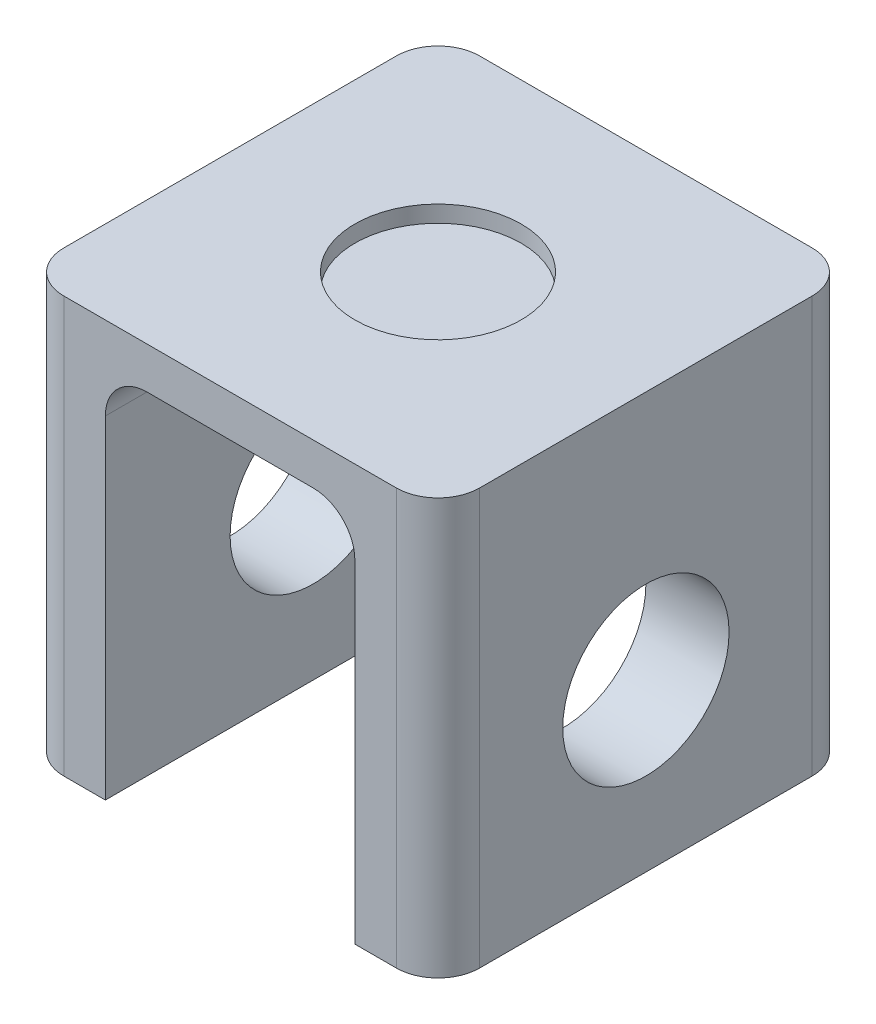
ISO-10303-21;
HEADER;
FILE_DESCRIPTION(('STEP AP214'),'2;1');
FILE_NAME('part.step','',(''),(''),'','','');
FILE_SCHEMA(('AUTOMOTIVE_DESIGN { 1 0 10303 214 1 1 1 1 }'));
ENDSEC;
DATA;
#1=APPLICATION_CONTEXT('core data for automotive mechanical design processes');
#2=APPLICATION_PROTOCOL_DEFINITION('international standard','automotive_design',2000,#1);
#3=PRODUCT_CONTEXT('',#1,'mechanical');
#4=PRODUCT('Part','Part','',(#3));
#5=PRODUCT_RELATED_PRODUCT_CATEGORY('part','',(#4));
#6=PRODUCT_DEFINITION_FORMATION('','',#4);
#7=PRODUCT_DEFINITION_CONTEXT('part definition',#1,'design');
#8=PRODUCT_DEFINITION('design','',#6,#7);
#9=PRODUCT_DEFINITION_SHAPE('','',#8);
#10=(LENGTH_UNIT() NAMED_UNIT(*) SI_UNIT(.MILLI.,.METRE.));
#11=(NAMED_UNIT(*) PLANE_ANGLE_UNIT() SI_UNIT($,.RADIAN.));
#12=(NAMED_UNIT(*) SI_UNIT($,.STERADIAN.) SOLID_ANGLE_UNIT());
#13=UNCERTAINTY_MEASURE_WITH_UNIT(LENGTH_MEASURE(1.E-05),#10,'distance_accuracy_value','');
#14=(GEOMETRIC_REPRESENTATION_CONTEXT(3) GLOBAL_UNCERTAINTY_ASSIGNED_CONTEXT((#13)) GLOBAL_UNIT_ASSIGNED_CONTEXT((#10,
#11,#12)) REPRESENTATION_CONTEXT('',''));
#15=CARTESIAN_POINT('',(0.,0.,0.));
#16=DIRECTION('',(0.,0.,1.));
#17=DIRECTION('',(1.,0.,0.));
#18=AXIS2_PLACEMENT_3D('',#15,#16,#17);
#19=CARTESIAN_POINT('',(0.,0.,0.));
#20=DIRECTION('',(0.,-1.,0.));
#21=DIRECTION('',(0.,0.,-1.));
#22=AXIS2_PLACEMENT_3D('',#19,#20,#21);
#23=PLANE('',#22);
#24=DIRECTION('',(0.,0.,-1.));
#25=VECTOR('',#24,1.);
#26=CARTESIAN_POINT('',(50.,0.,50.));
#27=LINE('',#26,#25);
#28=CARTESIAN_POINT('',(50.,0.,40.));
#29=VERTEX_POINT('',#28);
#30=CARTESIAN_POINT('',(50.,0.,-40.));
#31=VERTEX_POINT('',#30);
#32=EDGE_CURVE('E302',#29,#31,#27,.T.);
#33=ORIENTED_EDGE('',*,*,#32,.F.);
#34=CARTESIAN_POINT('',(40.,0.,40.));
#35=DIRECTION('',(0.,-1.,0.));
#36=DIRECTION('',(0.,0.,-1.));
#37=AXIS2_PLACEMENT_3D('',#34,#35,#36);
#38=CIRCLE('',#37,10.);
#39=CARTESIAN_POINT('',(40.,0.,50.));
#40=VERTEX_POINT('',#39);
#41=EDGE_CURVE('E168',#29,#40,#38,.T.);
#42=ORIENTED_EDGE('',*,*,#41,.T.);
#43=DIRECTION('',(1.,0.,0.));
#44=VECTOR('',#43,1.);
#45=CARTESIAN_POINT('',(-50.,0.,50.));
#46=LINE('',#45,#44);
#47=CARTESIAN_POINT('',(30.,0.,50.));
#48=VERTEX_POINT('',#47);
#49=EDGE_CURVE('E149',#48,#40,#46,.T.);
#50=ORIENTED_EDGE('',*,*,#49,.F.);
#51=DIRECTION('',(0.,0.,1.));
#52=VECTOR('',#51,1.);
#53=CARTESIAN_POINT('',(30.,0.,-50.));
#54=LINE('',#53,#52);
#55=CARTESIAN_POINT('',(30.,0.,-50.));
#56=VERTEX_POINT('',#55);
#57=EDGE_CURVE('E157',#56,#48,#54,.T.);
#58=ORIENTED_EDGE('',*,*,#57,.F.);
#59=DIRECTION('',(-1.,0.,0.));
#60=VECTOR('',#59,1.);
#61=CARTESIAN_POINT('',(-50.,0.,-50.));
#62=LINE('',#61,#60);
#63=CARTESIAN_POINT('',(40.,0.,-50.));
#64=VERTEX_POINT('',#63);
#65=EDGE_CURVE('E176',#64,#56,#62,.T.);
#66=ORIENTED_EDGE('',*,*,#65,.F.);
#67=CARTESIAN_POINT('',(40.,0.,-40.));
#68=DIRECTION('',(0.,-1.,0.));
#69=DIRECTION('',(0.,0.,-1.));
#70=AXIS2_PLACEMENT_3D('',#67,#68,#69);
#71=CIRCLE('',#70,10.);
#72=EDGE_CURVE('E218',#64,#31,#71,.T.);
#73=ORIENTED_EDGE('',*,*,#72,.T.);
#74=EDGE_LOOP('',(#33,#42,#50,#58,#66,#73));
#75=FACE_BOUND('',#74,.T.);
#76=ADVANCED_FACE('F44',(#75),#23,.T.);
#77=CARTESIAN_POINT('',(50.,100.,50.));
#78=DIRECTION('',(-1.,0.,0.));
#79=DIRECTION('',(0.,0.,1.));
#80=AXIS2_PLACEMENT_3D('',#77,#78,#79);
#81=PLANE('',#80);
#82=CARTESIAN_POINT('',(50.,40.,0.));
#83=DIRECTION('',(-1.,0.,0.));
#84=DIRECTION('',(0.,0.,1.));
#85=AXIS2_PLACEMENT_3D('',#82,#83,#84);
#86=CIRCLE('',#85,20.);
#87=CARTESIAN_POINT('',(50.,40.,20.));
#88=VERTEX_POINT('',#87);
#89=EDGE_CURVE('E170',#88,#88,#86,.T.);
#90=ORIENTED_EDGE('',*,*,#89,.T.);
#91=EDGE_LOOP('',(#90));
#92=FACE_BOUND('',#91,.T.);
#93=DIRECTION('',(0.,0.,-1.));
#94=VECTOR('',#93,1.);
#95=CARTESIAN_POINT('',(50.,100.,50.));
#96=LINE('',#95,#94);
#97=CARTESIAN_POINT('',(50.,100.,40.));
#98=VERTEX_POINT('',#97);
#99=CARTESIAN_POINT('',(50.,100.,-40.));
#100=VERTEX_POINT('',#99);
#101=EDGE_CURVE('E172',#98,#100,#96,.T.);
#102=ORIENTED_EDGE('',*,*,#101,.F.);
#103=DIRECTION('',(0.,-1.,0.));
#104=VECTOR('',#103,1.);
#105=CARTESIAN_POINT('',(50.,100.,40.));
#106=LINE('',#105,#104);
#107=EDGE_CURVE('E216',#98,#29,#106,.T.);
#108=ORIENTED_EDGE('',*,*,#107,.T.);
#109=ORIENTED_EDGE('',*,*,#32,.T.);
#110=DIRECTION('',(0.,-1.,0.));
#111=VECTOR('',#110,1.);
#112=CARTESIAN_POINT('',(50.,100.,-40.));
#113=LINE('',#112,#111);
#114=EDGE_CURVE('E212',#31,#100,#113,.F.);
#115=ORIENTED_EDGE('',*,*,#114,.T.);
#116=EDGE_LOOP('',(#102,#108,#109,#115));
#117=FACE_BOUND('',#116,.T.);
#118=ADVANCED_FACE('F256',(#92,#117),#81,.F.);
#119=CARTESIAN_POINT('',(-50.,100.,-50.));
#120=DIRECTION('',(0.,0.,1.));
#121=DIRECTION('',(1.,0.,0.));
#122=AXIS2_PLACEMENT_3D('',#119,#120,#121);
#123=PLANE('',#122);
#124=CARTESIAN_POINT('',(-30.,0.,-50.));
#125=VERTEX_POINT('',#124);
#126=CARTESIAN_POINT('',(-40.,0.,-50.));
#127=VERTEX_POINT('',#126);
#128=EDGE_CURVE('E307',#125,#127,#62,.T.);
#129=ORIENTED_EDGE('',*,*,#128,.T.);
#130=DIRECTION('',(0.,-1.,0.));
#131=VECTOR('',#130,1.);
#132=CARTESIAN_POINT('',(-40.,100.,-50.));
#133=LINE('',#132,#131);
#134=CARTESIAN_POINT('',(-40.,100.,-50.));
#135=VERTEX_POINT('',#134);
#136=EDGE_CURVE('E200',#127,#135,#133,.F.);
#137=ORIENTED_EDGE('',*,*,#136,.T.);
#138=DIRECTION('',(-1.,0.,0.));
#139=VECTOR('',#138,1.);
#140=CARTESIAN_POINT('',(-50.,100.,-50.));
#141=LINE('',#140,#139);
#142=CARTESIAN_POINT('',(40.,100.,-50.));
#143=VERTEX_POINT('',#142);
#144=EDGE_CURVE('E304',#143,#135,#141,.T.);
#145=ORIENTED_EDGE('',*,*,#144,.F.);
#146=DIRECTION('',(0.,-1.,0.));
#147=VECTOR('',#146,1.);
#148=CARTESIAN_POINT('',(40.,100.,-50.));
#149=LINE('',#148,#147);
#150=EDGE_CURVE('E198',#143,#64,#149,.T.);
#151=ORIENTED_EDGE('',*,*,#150,.T.);
#152=ORIENTED_EDGE('',*,*,#65,.T.);
#153=DIRECTION('',(0.,-1.,0.));
#154=VECTOR('',#153,1.);
#155=CARTESIAN_POINT('',(30.,90.,-50.));
#156=LINE('',#155,#154);
#157=CARTESIAN_POINT('',(30.,80.,-50.));
#158=VERTEX_POINT('',#157);
#159=EDGE_CURVE('E165',#158,#56,#156,.T.);
#160=ORIENTED_EDGE('',*,*,#159,.F.);
#161=CARTESIAN_POINT('',(20.,80.,-50.));
#162=DIRECTION('',(0.,0.,1.));
#163=DIRECTION('',(1.,0.,0.));
#164=AXIS2_PLACEMENT_3D('',#161,#162,#163);
#165=CIRCLE('',#164,10.);
#166=CARTESIAN_POINT('',(20.,90.,-50.));
#167=VERTEX_POINT('',#166);
#168=EDGE_CURVE('E231',#158,#167,#165,.T.);
#169=ORIENTED_EDGE('',*,*,#168,.T.);
#170=DIRECTION('',(1.,0.,0.));
#171=VECTOR('',#170,1.);
#172=CARTESIAN_POINT('',(-30.,90.,-50.));
#173=LINE('',#172,#171);
#174=CARTESIAN_POINT('',(-20.,90.,-50.));
#175=VERTEX_POINT('',#174);
#176=EDGE_CURVE('E156',#175,#167,#173,.T.);
#177=ORIENTED_EDGE('',*,*,#176,.F.);
#178=CARTESIAN_POINT('',(-20.,80.,-50.));
#179=DIRECTION('',(0.,0.,1.));
#180=DIRECTION('',(1.,0.,0.));
#181=AXIS2_PLACEMENT_3D('',#178,#179,#180);
#182=CIRCLE('',#181,10.);
#183=CARTESIAN_POINT('',(-30.,80.,-50.));
#184=VERTEX_POINT('',#183);
#185=EDGE_CURVE('E52',#175,#184,#182,.T.);
#186=ORIENTED_EDGE('',*,*,#185,.T.);
#187=DIRECTION('',(0.,-1.,0.));
#188=VECTOR('',#187,1.);
#189=CARTESIAN_POINT('',(-30.,90.,-50.));
#190=LINE('',#189,#188);
#191=EDGE_CURVE('E313',#184,#125,#190,.T.);
#192=ORIENTED_EDGE('',*,*,#191,.T.);
#193=EDGE_LOOP('',(#129,#137,#145,#151,#152,#160,#169,#177,#186,#192));
#194=FACE_BOUND('',#193,.T.);
#195=ADVANCED_FACE('F237',(#194),#123,.F.);
#196=CARTESIAN_POINT('',(-50.,100.,50.));
#197=DIRECTION('',(1.,0.,0.));
#198=DIRECTION('',(0.,0.,-1.));
#199=AXIS2_PLACEMENT_3D('',#196,#197,#198);
#200=PLANE('',#199);
#201=CARTESIAN_POINT('',(-50.,40.,0.));
#202=DIRECTION('',(-1.,0.,0.));
#203=DIRECTION('',(0.,0.,1.));
#204=AXIS2_PLACEMENT_3D('',#201,#202,#203);
#205=CIRCLE('',#204,20.);
#206=CARTESIAN_POINT('',(-50.,40.,20.));
#207=VERTEX_POINT('',#206);
#208=EDGE_CURVE('E183',#207,#207,#205,.T.);
#209=ORIENTED_EDGE('',*,*,#208,.F.);
#210=EDGE_LOOP('',(#209));
#211=FACE_BOUND('',#210,.T.);
#212=DIRECTION('',(0.,0.,1.));
#213=VECTOR('',#212,1.);
#214=CARTESIAN_POINT('',(-50.,100.,50.));
#215=LINE('',#214,#213);
#216=CARTESIAN_POINT('',(-50.,100.,-40.));
#217=VERTEX_POINT('',#216);
#218=CARTESIAN_POINT('',(-50.,100.,40.));
#219=VERTEX_POINT('',#218);
#220=EDGE_CURVE('E299',#217,#219,#215,.T.);
#221=ORIENTED_EDGE('',*,*,#220,.F.);
#222=DIRECTION('',(0.,-1.,0.));
#223=VECTOR('',#222,1.);
#224=CARTESIAN_POINT('',(-50.,100.,-40.));
#225=LINE('',#224,#223);
#226=CARTESIAN_POINT('',(-50.,0.,-40.));
#227=VERTEX_POINT('',#226);
#228=EDGE_CURVE('E186',#217,#227,#225,.T.);
#229=ORIENTED_EDGE('',*,*,#228,.T.);
#230=DIRECTION('',(0.,0.,1.));
#231=VECTOR('',#230,1.);
#232=CARTESIAN_POINT('',(-50.,0.,50.));
#233=LINE('',#232,#231);
#234=CARTESIAN_POINT('',(-50.,0.,40.));
#235=VERTEX_POINT('',#234);
#236=EDGE_CURVE('E175',#227,#235,#233,.T.);
#237=ORIENTED_EDGE('',*,*,#236,.T.);
#238=DIRECTION('',(0.,-1.,0.));
#239=VECTOR('',#238,1.);
#240=CARTESIAN_POINT('',(-50.,100.,40.));
#241=LINE('',#240,#239);
#242=EDGE_CURVE('E188',#235,#219,#241,.F.);
#243=ORIENTED_EDGE('',*,*,#242,.T.);
#244=EDGE_LOOP('',(#221,#229,#237,#243));
#245=FACE_BOUND('',#244,.T.);
#246=ADVANCED_FACE('F290',(#211,#245),#200,.F.);
#247=CARTESIAN_POINT('',(-50.,100.,50.));
#248=DIRECTION('',(0.,0.,-1.));
#249=DIRECTION('',(-1.,0.,0.));
#250=AXIS2_PLACEMENT_3D('',#247,#248,#249);
#251=PLANE('',#250);
#252=DIRECTION('',(1.,0.,0.));
#253=VECTOR('',#252,1.);
#254=CARTESIAN_POINT('',(-50.,100.,50.));
#255=LINE('',#254,#253);
#256=CARTESIAN_POINT('',(-40.,100.,50.));
#257=VERTEX_POINT('',#256);
#258=CARTESIAN_POINT('',(40.,100.,50.));
#259=VERTEX_POINT('',#258);
#260=EDGE_CURVE('E189',#257,#259,#255,.T.);
#261=ORIENTED_EDGE('',*,*,#260,.F.);
#262=DIRECTION('',(0.,-1.,0.));
#263=VECTOR('',#262,1.);
#264=CARTESIAN_POINT('',(-40.,100.,50.));
#265=LINE('',#264,#263);
#266=CARTESIAN_POINT('',(-40.,0.,50.));
#267=VERTEX_POINT('',#266);
#268=EDGE_CURVE('E211',#257,#267,#265,.T.);
#269=ORIENTED_EDGE('',*,*,#268,.T.);
#270=CARTESIAN_POINT('',(-30.,0.,50.));
#271=VERTEX_POINT('',#270);
#272=EDGE_CURVE('E173',#267,#271,#46,.T.);
#273=ORIENTED_EDGE('',*,*,#272,.T.);
#274=DIRECTION('',(0.,-1.,0.));
#275=VECTOR('',#274,1.);
#276=CARTESIAN_POINT('',(-30.,90.,50.));
#277=LINE('',#276,#275);
#278=CARTESIAN_POINT('',(-30.,80.,50.));
#279=VERTEX_POINT('',#278);
#280=EDGE_CURVE('E154',#279,#271,#277,.T.);
#281=ORIENTED_EDGE('',*,*,#280,.F.);
#282=CARTESIAN_POINT('',(-20.,80.,50.));
#283=DIRECTION('',(0.,0.,-1.));
#284=DIRECTION('',(-1.,0.,0.));
#285=AXIS2_PLACEMENT_3D('',#282,#283,#284);
#286=CIRCLE('',#285,10.);
#287=CARTESIAN_POINT('',(-20.,90.,50.));
#288=VERTEX_POINT('',#287);
#289=EDGE_CURVE('E11',#279,#288,#286,.T.);
#290=ORIENTED_EDGE('',*,*,#289,.T.);
#291=DIRECTION('',(-1.,0.,0.));
#292=VECTOR('',#291,1.);
#293=CARTESIAN_POINT('',(-30.,90.,50.));
#294=LINE('',#293,#292);
#295=CARTESIAN_POINT('',(20.,90.,50.));
#296=VERTEX_POINT('',#295);
#297=EDGE_CURVE('E241',#296,#288,#294,.T.);
#298=ORIENTED_EDGE('',*,*,#297,.F.);
#299=CARTESIAN_POINT('',(20.,80.,50.));
#300=DIRECTION('',(0.,0.,-1.));
#301=DIRECTION('',(-1.,0.,0.));
#302=AXIS2_PLACEMENT_3D('',#299,#300,#301);
#303=CIRCLE('',#302,10.);
#304=CARTESIAN_POINT('',(30.,80.,50.));
#305=VERTEX_POINT('',#304);
#306=EDGE_CURVE('E155',#296,#305,#303,.T.);
#307=ORIENTED_EDGE('',*,*,#306,.T.);
#308=DIRECTION('',(0.,-1.,0.));
#309=VECTOR('',#308,1.);
#310=CARTESIAN_POINT('',(30.,90.,50.));
#311=LINE('',#310,#309);
#312=EDGE_CURVE('E145',#305,#48,#311,.T.);
#313=ORIENTED_EDGE('',*,*,#312,.T.);
#314=ORIENTED_EDGE('',*,*,#49,.T.);
#315=DIRECTION('',(0.,-1.,0.));
#316=VECTOR('',#315,1.);
#317=CARTESIAN_POINT('',(40.,100.,50.));
#318=LINE('',#317,#316);
#319=EDGE_CURVE('E207',#40,#259,#318,.F.);
#320=ORIENTED_EDGE('',*,*,#319,.T.);
#321=EDGE_LOOP('',(#261,#269,#273,#281,#290,#298,#307,#313,#314,#320));
#322=FACE_BOUND('',#321,.T.);
#323=ADVANCED_FACE('F150',(#322),#251,.F.);
#324=CARTESIAN_POINT('',(0.,100.,0.));
#325=DIRECTION('',(0.,-1.,0.));
#326=DIRECTION('',(0.,0.,-1.));
#327=AXIS2_PLACEMENT_3D('',#324,#325,#326);
#328=PLANE('',#327);
#329=CARTESIAN_POINT('',(0.,100.,0.));
#330=DIRECTION('',(0.,1.,0.));
#331=DIRECTION('',(0.,0.,1.));
#332=AXIS2_PLACEMENT_3D('',#329,#330,#331);
#333=CIRCLE('',#332,20.);
#334=CARTESIAN_POINT('',(0.,100.,20.));
#335=VERTEX_POINT('',#334);
#336=EDGE_CURVE('E325',#335,#335,#333,.T.);
#337=ORIENTED_EDGE('',*,*,#336,.F.);
#338=EDGE_LOOP('',(#337));
#339=FACE_BOUND('',#338,.T.);
#340=ORIENTED_EDGE('',*,*,#144,.T.);
#341=CARTESIAN_POINT('',(-40.,100.,-40.));
#342=DIRECTION('',(0.,-1.,0.));
#343=DIRECTION('',(0.,0.,-1.));
#344=AXIS2_PLACEMENT_3D('',#341,#342,#343);
#345=CIRCLE('',#344,10.);
#346=EDGE_CURVE('E210',#135,#217,#345,.F.);
#347=ORIENTED_EDGE('',*,*,#346,.T.);
#348=ORIENTED_EDGE('',*,*,#220,.T.);
#349=CARTESIAN_POINT('',(-40.,100.,40.));
#350=DIRECTION('',(0.,-1.,0.));
#351=DIRECTION('',(0.,0.,-1.));
#352=AXIS2_PLACEMENT_3D('',#349,#350,#351);
#353=CIRCLE('',#352,10.);
#354=EDGE_CURVE('E202',#219,#257,#353,.F.);
#355=ORIENTED_EDGE('',*,*,#354,.T.);
#356=ORIENTED_EDGE('',*,*,#260,.T.);
#357=CARTESIAN_POINT('',(40.,100.,40.));
#358=DIRECTION('',(0.,-1.,0.));
#359=DIRECTION('',(0.,0.,-1.));
#360=AXIS2_PLACEMENT_3D('',#357,#358,#359);
#361=CIRCLE('',#360,10.);
#362=EDGE_CURVE('E201',#259,#98,#361,.F.);
#363=ORIENTED_EDGE('',*,*,#362,.T.);
#364=ORIENTED_EDGE('',*,*,#101,.T.);
#365=CARTESIAN_POINT('',(40.,100.,-40.));
#366=DIRECTION('',(0.,-1.,0.));
#367=DIRECTION('',(0.,0.,-1.));
#368=AXIS2_PLACEMENT_3D('',#365,#366,#367);
#369=CIRCLE('',#368,10.);
#370=EDGE_CURVE('E203',#100,#143,#369,.F.);
#371=ORIENTED_EDGE('',*,*,#370,.T.);
#372=EDGE_LOOP('',(#340,#347,#348,#355,#356,#363,#364,#371));
#373=FACE_BOUND('',#372,.T.);
#374=ADVANCED_FACE('F271',(#339,#373),#328,.F.);
#375=ORIENTED_EDGE('',*,*,#236,.F.);
#376=CARTESIAN_POINT('',(-40.,0.,-40.));
#377=DIRECTION('',(0.,-1.,0.));
#378=DIRECTION('',(0.,0.,-1.));
#379=AXIS2_PLACEMENT_3D('',#376,#377,#378);
#380=CIRCLE('',#379,10.);
#381=EDGE_CURVE('E193',#227,#127,#380,.T.);
#382=ORIENTED_EDGE('',*,*,#381,.T.);
#383=ORIENTED_EDGE('',*,*,#128,.F.);
#384=DIRECTION('',(0.,0.,-1.));
#385=VECTOR('',#384,1.);
#386=CARTESIAN_POINT('',(-30.,0.,-50.));
#387=LINE('',#386,#385);
#388=EDGE_CURVE('E167',#271,#125,#387,.T.);
#389=ORIENTED_EDGE('',*,*,#388,.F.);
#390=ORIENTED_EDGE('',*,*,#272,.F.);
#391=CARTESIAN_POINT('',(-40.,0.,40.));
#392=DIRECTION('',(0.,-1.,0.));
#393=DIRECTION('',(0.,0.,-1.));
#394=AXIS2_PLACEMENT_3D('',#391,#392,#393);
#395=CIRCLE('',#394,10.);
#396=EDGE_CURVE('E191',#267,#235,#395,.T.);
#397=ORIENTED_EDGE('',*,*,#396,.T.);
#398=EDGE_LOOP('',(#375,#382,#383,#389,#390,#397));
#399=FACE_BOUND('',#398,.T.);
#400=ADVANCED_FACE('F257',(#399),#23,.T.);
#401=CARTESIAN_POINT('',(0.,96.,0.));
#402=DIRECTION('',(0.,1.,0.));
#403=DIRECTION('',(0.,0.,1.));
#404=AXIS2_PLACEMENT_3D('',#401,#402,#403);
#405=CYLINDRICAL_SURFACE('',#404,20.);
#406=CARTESIAN_POINT('',(0.,96.,0.));
#407=DIRECTION('',(0.,1.,0.));
#408=DIRECTION('',(0.,0.,1.));
#409=AXIS2_PLACEMENT_3D('',#406,#407,#408);
#410=CIRCLE('',#409,20.);
#411=CARTESIAN_POINT('',(0.,96.,20.));
#412=VERTEX_POINT('',#411);
#413=EDGE_CURVE('E306',#412,#412,#410,.T.);
#414=ORIENTED_EDGE('',*,*,#413,.F.);
#415=EDGE_LOOP('',(#414));
#416=FACE_BOUND('',#415,.T.);
#417=ORIENTED_EDGE('',*,*,#336,.T.);
#418=EDGE_LOOP('',(#417));
#419=FACE_BOUND('',#418,.T.);
#420=ADVANCED_FACE('F269',(#416,#419),#405,.F.);
#421=CARTESIAN_POINT('',(0.,96.,0.));
#422=DIRECTION('',(0.,1.,0.));
#423=DIRECTION('',(0.,0.,1.));
#424=AXIS2_PLACEMENT_3D('',#421,#422,#423);
#425=PLANE('',#424);
#426=ORIENTED_EDGE('',*,*,#413,.T.);
#427=EDGE_LOOP('',(#426));
#428=FACE_BOUND('',#427,.T.);
#429=ADVANCED_FACE('F279',(#428),#425,.T.);
#430=CARTESIAN_POINT('',(30.,90.,-50.));
#431=DIRECTION('',(1.,0.,0.));
#432=DIRECTION('',(0.,0.,-1.));
#433=AXIS2_PLACEMENT_3D('',#430,#431,#432);
#434=PLANE('',#433);
#435=CARTESIAN_POINT('',(30.,40.,0.));
#436=DIRECTION('',(1.,0.,0.));
#437=DIRECTION('',(0.,0.,-1.));
#438=AXIS2_PLACEMENT_3D('',#435,#436,#437);
#439=CIRCLE('',#438,20.);
#440=CARTESIAN_POINT('',(30.,40.,-20.));
#441=VERTEX_POINT('',#440);
#442=EDGE_CURVE('E184',#441,#441,#439,.T.);
#443=ORIENTED_EDGE('',*,*,#442,.T.);
#444=EDGE_LOOP('',(#443));
#445=FACE_BOUND('',#444,.T.);
#446=ORIENTED_EDGE('',*,*,#312,.F.);
#447=DIRECTION('',(0.,0.,1.));
#448=VECTOR('',#447,1.);
#449=CARTESIAN_POINT('',(30.,80.,-50.));
#450=LINE('',#449,#448);
#451=EDGE_CURVE('E226',#305,#158,#450,.F.);
#452=ORIENTED_EDGE('',*,*,#451,.T.);
#453=ORIENTED_EDGE('',*,*,#159,.T.);
#454=ORIENTED_EDGE('',*,*,#57,.T.);
#455=EDGE_LOOP('',(#446,#452,#453,#454));
#456=FACE_BOUND('',#455,.T.);
#457=ADVANCED_FACE('F159',(#445,#456),#434,.F.);
#458=CARTESIAN_POINT('',(-30.,90.,-50.));
#459=DIRECTION('',(-1.,0.,0.));
#460=DIRECTION('',(0.,0.,1.));
#461=AXIS2_PLACEMENT_3D('',#458,#459,#460);
#462=PLANE('',#461);
#463=CARTESIAN_POINT('',(-30.,40.,0.));
#464=DIRECTION('',(-1.,0.,0.));
#465=DIRECTION('',(0.,0.,1.));
#466=AXIS2_PLACEMENT_3D('',#463,#464,#465);
#467=CIRCLE('',#466,20.);
#468=CARTESIAN_POINT('',(-30.,40.,20.));
#469=VERTEX_POINT('',#468);
#470=EDGE_CURVE('E182',#469,#469,#467,.T.);
#471=ORIENTED_EDGE('',*,*,#470,.T.);
#472=EDGE_LOOP('',(#471));
#473=FACE_BOUND('',#472,.T.);
#474=ORIENTED_EDGE('',*,*,#191,.F.);
#475=DIRECTION('',(0.,0.,-1.));
#476=VECTOR('',#475,1.);
#477=CARTESIAN_POINT('',(-30.,80.,50.));
#478=LINE('',#477,#476);
#479=EDGE_CURVE('E58',#184,#279,#478,.F.);
#480=ORIENTED_EDGE('',*,*,#479,.T.);
#481=ORIENTED_EDGE('',*,*,#280,.T.);
#482=ORIENTED_EDGE('',*,*,#388,.T.);
#483=EDGE_LOOP('',(#474,#480,#481,#482));
#484=FACE_BOUND('',#483,.T.);
#485=ADVANCED_FACE('F389',(#473,#484),#462,.F.);
#486=CARTESIAN_POINT('',(0.,90.,0.));
#487=DIRECTION('',(0.,1.,0.));
#488=DIRECTION('',(0.,0.,1.));
#489=AXIS2_PLACEMENT_3D('',#486,#487,#488);
#490=PLANE('',#489);
#491=ORIENTED_EDGE('',*,*,#176,.T.);
#492=DIRECTION('',(0.,0.,1.));
#493=VECTOR('',#492,1.);
#494=CARTESIAN_POINT('',(20.,90.,50.));
#495=LINE('',#494,#493);
#496=EDGE_CURVE('E223',#167,#296,#495,.T.);
#497=ORIENTED_EDGE('',*,*,#496,.T.);
#498=ORIENTED_EDGE('',*,*,#297,.T.);
#499=DIRECTION('',(0.,0.,-1.));
#500=VECTOR('',#499,1.);
#501=CARTESIAN_POINT('',(-20.,90.,-50.));
#502=LINE('',#501,#500);
#503=EDGE_CURVE('E225',#288,#175,#502,.T.);
#504=ORIENTED_EDGE('',*,*,#503,.T.);
#505=EDGE_LOOP('',(#491,#497,#498,#504));
#506=FACE_BOUND('',#505,.T.);
#507=ADVANCED_FACE('F238',(#506),#490,.F.);
#508=CARTESIAN_POINT('',(85.,40.,0.));
#509=DIRECTION('',(-1.,0.,0.));
#510=DIRECTION('',(0.,0.,1.));
#511=AXIS2_PLACEMENT_3D('',#508,#509,#510);
#512=CYLINDRICAL_SURFACE('',#511,20.);
#513=ORIENTED_EDGE('',*,*,#208,.T.);
#514=EDGE_LOOP('',(#513));
#515=FACE_BOUND('',#514,.T.);
#516=ORIENTED_EDGE('',*,*,#470,.F.);
#517=EDGE_LOOP('',(#516));
#518=FACE_BOUND('',#517,.T.);
#519=ADVANCED_FACE('F339',(#515,#518),#512,.F.);
#520=ORIENTED_EDGE('',*,*,#442,.F.);
#521=EDGE_LOOP('',(#520));
#522=FACE_BOUND('',#521,.T.);
#523=ORIENTED_EDGE('',*,*,#89,.F.);
#524=EDGE_LOOP('',(#523));
#525=FACE_BOUND('',#524,.T.);
#526=ADVANCED_FACE('F353',(#522,#525),#512,.F.);
#527=CARTESIAN_POINT('',(-40.,100.,-40.));
#528=DIRECTION('',(0.,-1.,0.));
#529=DIRECTION('',(0.,0.,-1.));
#530=AXIS2_PLACEMENT_3D('',#527,#528,#529);
#531=CYLINDRICAL_SURFACE('',#530,10.);
#532=ORIENTED_EDGE('',*,*,#346,.F.);
#533=ORIENTED_EDGE('',*,*,#136,.F.);
#534=ORIENTED_EDGE('',*,*,#381,.F.);
#535=ORIENTED_EDGE('',*,*,#228,.F.);
#536=EDGE_LOOP('',(#532,#533,#534,#535));
#537=FACE_BOUND('',#536,.T.);
#538=ADVANCED_FACE('F316',(#537),#531,.T.);
#539=CARTESIAN_POINT('',(-40.,100.,40.));
#540=DIRECTION('',(0.,-1.,0.));
#541=DIRECTION('',(0.,0.,-1.));
#542=AXIS2_PLACEMENT_3D('',#539,#540,#541);
#543=CYLINDRICAL_SURFACE('',#542,10.);
#544=ORIENTED_EDGE('',*,*,#354,.F.);
#545=ORIENTED_EDGE('',*,*,#242,.F.);
#546=ORIENTED_EDGE('',*,*,#396,.F.);
#547=ORIENTED_EDGE('',*,*,#268,.F.);
#548=EDGE_LOOP('',(#544,#545,#546,#547));
#549=FACE_BOUND('',#548,.T.);
#550=ADVANCED_FACE('F291',(#549),#543,.T.);
#551=CARTESIAN_POINT('',(40.,100.,40.));
#552=DIRECTION('',(0.,-1.,0.));
#553=DIRECTION('',(0.,0.,-1.));
#554=AXIS2_PLACEMENT_3D('',#551,#552,#553);
#555=CYLINDRICAL_SURFACE('',#554,10.);
#556=ORIENTED_EDGE('',*,*,#362,.F.);
#557=ORIENTED_EDGE('',*,*,#319,.F.);
#558=ORIENTED_EDGE('',*,*,#41,.F.);
#559=ORIENTED_EDGE('',*,*,#107,.F.);
#560=EDGE_LOOP('',(#556,#557,#558,#559));
#561=FACE_BOUND('',#560,.T.);
#562=ADVANCED_FACE('F255',(#561),#555,.T.);
#563=CARTESIAN_POINT('',(40.,100.,-40.));
#564=DIRECTION('',(0.,-1.,0.));
#565=DIRECTION('',(0.,0.,-1.));
#566=AXIS2_PLACEMENT_3D('',#563,#564,#565);
#567=CYLINDRICAL_SURFACE('',#566,10.);
#568=ORIENTED_EDGE('',*,*,#370,.F.);
#569=ORIENTED_EDGE('',*,*,#114,.F.);
#570=ORIENTED_EDGE('',*,*,#72,.F.);
#571=ORIENTED_EDGE('',*,*,#150,.F.);
#572=EDGE_LOOP('',(#568,#569,#570,#571));
#573=FACE_BOUND('',#572,.T.);
#574=ADVANCED_FACE('F246',(#573),#567,.T.);
#575=CARTESIAN_POINT('',(20.,80.,0.));
#576=DIRECTION('',(0.,0.,-1.));
#577=DIRECTION('',(-1.,0.,0.));
#578=AXIS2_PLACEMENT_3D('',#575,#576,#577);
#579=CYLINDRICAL_SURFACE('',#578,10.);
#580=ORIENTED_EDGE('',*,*,#168,.F.);
#581=ORIENTED_EDGE('',*,*,#451,.F.);
#582=ORIENTED_EDGE('',*,*,#306,.F.);
#583=ORIENTED_EDGE('',*,*,#496,.F.);
#584=EDGE_LOOP('',(#580,#581,#582,#583));
#585=FACE_BOUND('',#584,.T.);
#586=ADVANCED_FACE('F242',(#585),#579,.F.);
#587=CARTESIAN_POINT('',(-20.,80.,0.));
#588=DIRECTION('',(0.,0.,1.));
#589=DIRECTION('',(1.,0.,0.));
#590=AXIS2_PLACEMENT_3D('',#587,#588,#589);
#591=CYLINDRICAL_SURFACE('',#590,10.);
#592=ORIENTED_EDGE('',*,*,#289,.F.);
#593=ORIENTED_EDGE('',*,*,#479,.F.);
#594=ORIENTED_EDGE('',*,*,#185,.F.);
#595=ORIENTED_EDGE('',*,*,#503,.F.);
#596=EDGE_LOOP('',(#592,#593,#594,#595));
#597=FACE_BOUND('',#596,.T.);
#598=ADVANCED_FACE('F50',(#597),#591,.F.);
#599=CLOSED_SHELL('',(#76,#118,#195,#246,#323,#374,#400,#420,#429,#457,#485,#507,#519,#526,#538,
#550,#562,#574,#586,#598));
#600=MANIFOLD_SOLID_BREP('B2',#599);
#601=ADVANCED_BREP_SHAPE_REPRESENTATION('',(#18,#600),#14);
#602=SHAPE_DEFINITION_REPRESENTATION(#9,#601);
ENDSEC;
END-ISO-10303-21;
